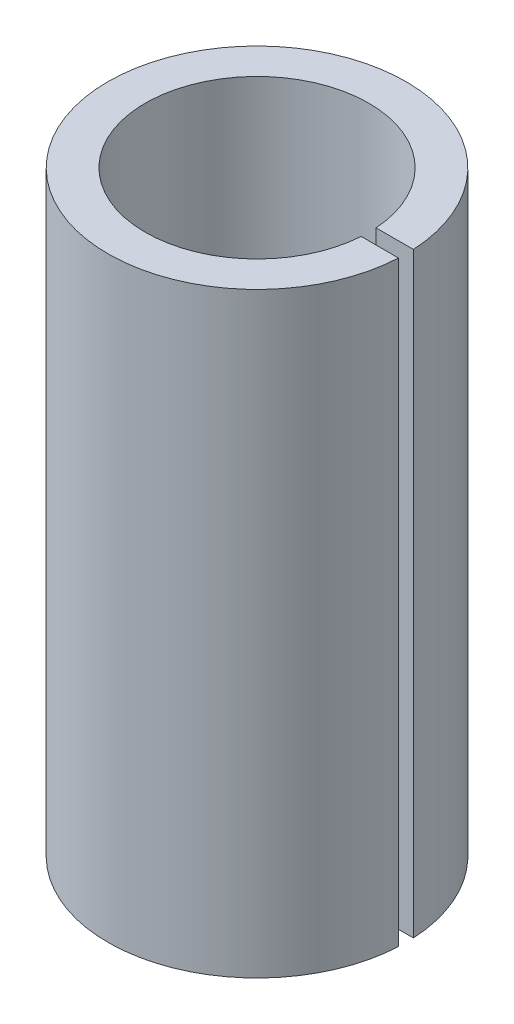
ISO-10303-21;
HEADER;
FILE_DESCRIPTION(('STEP AP214'),'2;1');
FILE_NAME('part.step','',(''),(''),'','','');
FILE_SCHEMA(('AUTOMOTIVE_DESIGN { 1 0 10303 214 1 1 1 1 }'));
ENDSEC;
DATA;
#1=APPLICATION_CONTEXT('core data for automotive mechanical design processes');
#2=APPLICATION_PROTOCOL_DEFINITION('international standard','automotive_design',2000,#1);
#3=PRODUCT_CONTEXT('',#1,'mechanical');
#4=PRODUCT('Part','Part','',(#3));
#5=PRODUCT_RELATED_PRODUCT_CATEGORY('part','',(#4));
#6=PRODUCT_DEFINITION_FORMATION('','',#4);
#7=PRODUCT_DEFINITION_CONTEXT('part definition',#1,'design');
#8=PRODUCT_DEFINITION('design','',#6,#7);
#9=PRODUCT_DEFINITION_SHAPE('','',#8);
#10=(LENGTH_UNIT() NAMED_UNIT(*) SI_UNIT(.MILLI.,.METRE.));
#11=(NAMED_UNIT(*) PLANE_ANGLE_UNIT() SI_UNIT($,.RADIAN.));
#12=(NAMED_UNIT(*) SI_UNIT($,.STERADIAN.) SOLID_ANGLE_UNIT());
#13=UNCERTAINTY_MEASURE_WITH_UNIT(LENGTH_MEASURE(1.E-05),#10,'distance_accuracy_value','');
#14=(GEOMETRIC_REPRESENTATION_CONTEXT(3) GLOBAL_UNCERTAINTY_ASSIGNED_CONTEXT((#13)) GLOBAL_UNIT_ASSIGNED_CONTEXT((#10,
#11,#12)) REPRESENTATION_CONTEXT('',''));
#15=CARTESIAN_POINT('',(0.,0.,0.));
#16=DIRECTION('',(0.,0.,1.));
#17=DIRECTION('',(1.,0.,0.));
#18=AXIS2_PLACEMENT_3D('',#15,#16,#17);
#19=CARTESIAN_POINT('',(0.,0.,0.));
#20=DIRECTION('',(0.,1.,0.));
#21=DIRECTION('',(0.,0.,1.));
#22=AXIS2_PLACEMENT_3D('',#19,#20,#21);
#23=CYLINDRICAL_SURFACE('',#22,1.5);
#24=DIRECTION('',(0.,1.,0.));
#25=VECTOR('',#24,1.);
#26=CARTESIAN_POINT('',(1.49666295470958,0.,0.1));
#27=LINE('',#26,#25);
#28=CARTESIAN_POINT('',(1.49666295470958,0.,0.1));
#29=VERTEX_POINT('',#28);
#30=CARTESIAN_POINT('',(1.49666295470958,8.,0.1));
#31=VERTEX_POINT('',#30);
#32=EDGE_CURVE('E53',#29,#31,#27,.T.);
#33=ORIENTED_EDGE('',*,*,#32,.F.);
#34=CARTESIAN_POINT('',(0.,0.,0.));
#35=DIRECTION('',(0.,1.,0.));
#36=DIRECTION('',(0.,0.,1.));
#37=AXIS2_PLACEMENT_3D('',#34,#35,#36);
#38=CIRCLE('',#37,1.5);
#39=CARTESIAN_POINT('',(1.49666295470958,0.,-0.1));
#40=VERTEX_POINT('',#39);
#41=EDGE_CURVE('E76',#40,#29,#38,.T.);
#42=ORIENTED_EDGE('',*,*,#41,.F.);
#43=DIRECTION('',(0.,1.,0.));
#44=VECTOR('',#43,1.);
#45=CARTESIAN_POINT('',(1.49666295470958,0.,-0.1));
#46=LINE('',#45,#44);
#47=CARTESIAN_POINT('',(1.49666295470958,8.,-0.1));
#48=VERTEX_POINT('',#47);
#49=EDGE_CURVE('E70',#48,#40,#46,.F.);
#50=ORIENTED_EDGE('',*,*,#49,.F.);
#51=CARTESIAN_POINT('',(0.,8.,0.));
#52=DIRECTION('',(0.,1.,0.));
#53=DIRECTION('',(0.,0.,1.));
#54=AXIS2_PLACEMENT_3D('',#51,#52,#53);
#55=CIRCLE('',#54,1.5);
#56=EDGE_CURVE('E80',#48,#31,#55,.T.);
#57=ORIENTED_EDGE('',*,*,#56,.T.);
#58=EDGE_LOOP('',(#33,#42,#50,#57));
#59=FACE_BOUND('',#58,.T.);
#60=ADVANCED_FACE('F32',(#59),#23,.F.);
#61=CARTESIAN_POINT('',(1.5,0.,0.));
#62=DIRECTION('',(0.,1.,0.));
#63=DIRECTION('',(0.,0.,1.));
#64=AXIS2_PLACEMENT_3D('',#61,#62,#63);
#65=PLANE('',#64);
#66=DIRECTION('',(-1.,0.,0.));
#67=VECTOR('',#66,1.);
#68=CARTESIAN_POINT('',(4.,0.,0.1));
#69=LINE('',#68,#67);
#70=CARTESIAN_POINT('',(1.99749843554382,0.,0.1));
#71=VERTEX_POINT('',#70);
#72=EDGE_CURVE('E98',#71,#29,#69,.T.);
#73=ORIENTED_EDGE('',*,*,#72,.F.);
#74=CARTESIAN_POINT('',(0.,0.,0.));
#75=DIRECTION('',(0.,1.,0.));
#76=DIRECTION('',(0.,0.,1.));
#77=AXIS2_PLACEMENT_3D('',#74,#75,#76);
#78=CIRCLE('',#77,2.);
#79=CARTESIAN_POINT('',(1.99749843554382,0.,-0.1));
#80=VERTEX_POINT('',#79);
#81=EDGE_CURVE('E87',#80,#71,#78,.T.);
#82=ORIENTED_EDGE('',*,*,#81,.F.);
#83=DIRECTION('',(-1.,0.,0.));
#84=VECTOR('',#83,1.);
#85=CARTESIAN_POINT('',(4.,0.,-0.1));
#86=LINE('',#85,#84);
#87=EDGE_CURVE('E99',#80,#40,#86,.T.);
#88=ORIENTED_EDGE('',*,*,#87,.T.);
#89=ORIENTED_EDGE('',*,*,#41,.T.);
#90=EDGE_LOOP('',(#73,#82,#88,#89));
#91=FACE_BOUND('',#90,.T.);
#92=ADVANCED_FACE('F96',(#91),#65,.F.);
#93=CARTESIAN_POINT('',(0.,0.,0.));
#94=DIRECTION('',(0.,1.,0.));
#95=DIRECTION('',(0.,0.,1.));
#96=AXIS2_PLACEMENT_3D('',#93,#94,#95);
#97=CYLINDRICAL_SURFACE('',#96,2.);
#98=DIRECTION('',(0.,1.,0.));
#99=VECTOR('',#98,1.);
#100=CARTESIAN_POINT('',(1.99749843554382,0.,0.1));
#101=LINE('',#100,#99);
#102=CARTESIAN_POINT('',(1.99749843554382,8.,0.1));
#103=VERTEX_POINT('',#102);
#104=EDGE_CURVE('E82',#103,#71,#101,.F.);
#105=ORIENTED_EDGE('',*,*,#104,.F.);
#106=CARTESIAN_POINT('',(0.,8.,0.));
#107=DIRECTION('',(0.,1.,0.));
#108=DIRECTION('',(0.,0.,1.));
#109=AXIS2_PLACEMENT_3D('',#106,#107,#108);
#110=CIRCLE('',#109,2.);
#111=CARTESIAN_POINT('',(1.99749843554382,8.,-0.1));
#112=VERTEX_POINT('',#111);
#113=EDGE_CURVE('E85',#112,#103,#110,.T.);
#114=ORIENTED_EDGE('',*,*,#113,.F.);
#115=DIRECTION('',(0.,1.,0.));
#116=VECTOR('',#115,1.);
#117=CARTESIAN_POINT('',(1.99749843554382,0.,-0.1));
#118=LINE('',#117,#116);
#119=EDGE_CURVE('E46',#80,#112,#118,.T.);
#120=ORIENTED_EDGE('',*,*,#119,.F.);
#121=ORIENTED_EDGE('',*,*,#81,.T.);
#122=EDGE_LOOP('',(#105,#114,#120,#121));
#123=FACE_BOUND('',#122,.T.);
#124=ADVANCED_FACE('F106',(#123),#97,.T.);
#125=CARTESIAN_POINT('',(2.,8.,0.));
#126=DIRECTION('',(0.,-1.,0.));
#127=DIRECTION('',(0.,0.,-1.));
#128=AXIS2_PLACEMENT_3D('',#125,#126,#127);
#129=PLANE('',#128);
#130=DIRECTION('',(1.,0.,0.));
#131=VECTOR('',#130,1.);
#132=CARTESIAN_POINT('',(2.,8.,0.1));
#133=LINE('',#132,#131);
#134=EDGE_CURVE('E11',#31,#103,#133,.T.);
#135=ORIENTED_EDGE('',*,*,#134,.F.);
#136=ORIENTED_EDGE('',*,*,#56,.F.);
#137=DIRECTION('',(-1.,0.,0.));
#138=VECTOR('',#137,1.);
#139=CARTESIAN_POINT('',(2.,8.,-0.1));
#140=LINE('',#139,#138);
#141=EDGE_CURVE('E39',#112,#48,#140,.T.);
#142=ORIENTED_EDGE('',*,*,#141,.F.);
#143=ORIENTED_EDGE('',*,*,#113,.T.);
#144=EDGE_LOOP('',(#135,#136,#142,#143));
#145=FACE_BOUND('',#144,.T.);
#146=ADVANCED_FACE('F84',(#145),#129,.F.);
#147=CARTESIAN_POINT('',(4.,0.,-0.1));
#148=DIRECTION('',(0.,0.,1.));
#149=DIRECTION('',(1.,0.,0.));
#150=AXIS2_PLACEMENT_3D('',#147,#148,#149);
#151=PLANE('',#150);
#152=ORIENTED_EDGE('',*,*,#49,.T.);
#153=ORIENTED_EDGE('',*,*,#87,.F.);
#154=ORIENTED_EDGE('',*,*,#119,.T.);
#155=ORIENTED_EDGE('',*,*,#141,.T.);
#156=EDGE_LOOP('',(#152,#153,#154,#155));
#157=FACE_BOUND('',#156,.T.);
#158=ADVANCED_FACE('F69',(#157),#151,.T.);
#159=CARTESIAN_POINT('',(4.,8.,0.1));
#160=DIRECTION('',(0.,0.,-1.));
#161=DIRECTION('',(-1.,0.,0.));
#162=AXIS2_PLACEMENT_3D('',#159,#160,#161);
#163=PLANE('',#162);
#164=ORIENTED_EDGE('',*,*,#32,.T.);
#165=ORIENTED_EDGE('',*,*,#134,.T.);
#166=ORIENTED_EDGE('',*,*,#104,.T.);
#167=ORIENTED_EDGE('',*,*,#72,.T.);
#168=EDGE_LOOP('',(#164,#165,#166,#167));
#169=FACE_BOUND('',#168,.T.);
#170=ADVANCED_FACE('F104',(#169),#163,.T.);
#171=CLOSED_SHELL('',(#60,#92,#124,#146,#158,#170));
#172=MANIFOLD_SOLID_BREP('B2',#171);
#173=ADVANCED_BREP_SHAPE_REPRESENTATION('',(#18,#172),#14);
#174=SHAPE_DEFINITION_REPRESENTATION(#9,#173);
ENDSEC;
END-ISO-10303-21;
